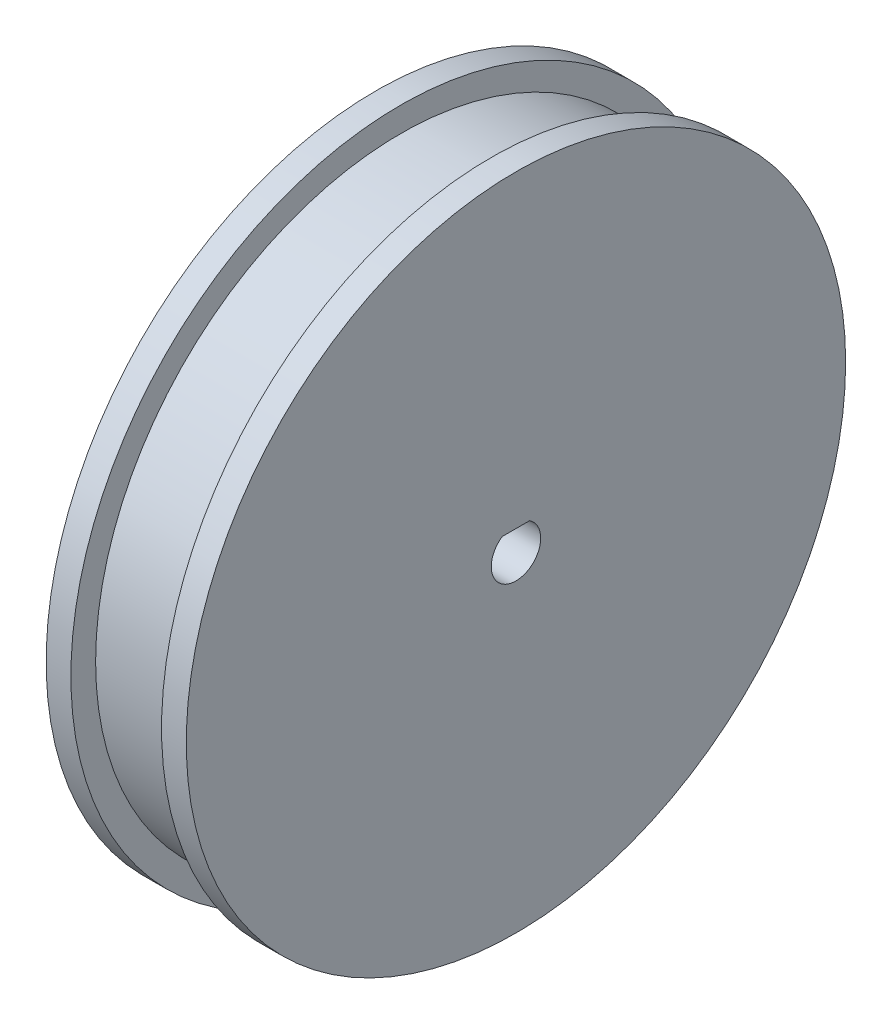
ISO-10303-21;
HEADER;
FILE_DESCRIPTION(('STEP AP214'),'2;1');
FILE_NAME('part.step','',(''),(''),'','','');
FILE_SCHEMA(('AUTOMOTIVE_DESIGN { 1 0 10303 214 1 1 1 1 }'));
ENDSEC;
DATA;
#1=APPLICATION_CONTEXT('core data for automotive mechanical design processes');
#2=APPLICATION_PROTOCOL_DEFINITION('international standard','automotive_design',2000,#1);
#3=PRODUCT_CONTEXT('',#1,'mechanical');
#4=PRODUCT('Part','Part','',(#3));
#5=PRODUCT_RELATED_PRODUCT_CATEGORY('part','',(#4));
#6=PRODUCT_DEFINITION_FORMATION('','',#4);
#7=PRODUCT_DEFINITION_CONTEXT('part definition',#1,'design');
#8=PRODUCT_DEFINITION('design','',#6,#7);
#9=PRODUCT_DEFINITION_SHAPE('','',#8);
#10=(LENGTH_UNIT() NAMED_UNIT(*) SI_UNIT(.MILLI.,.METRE.));
#11=(NAMED_UNIT(*) PLANE_ANGLE_UNIT() SI_UNIT($,.RADIAN.));
#12=(NAMED_UNIT(*) SI_UNIT($,.STERADIAN.) SOLID_ANGLE_UNIT());
#13=UNCERTAINTY_MEASURE_WITH_UNIT(LENGTH_MEASURE(1.E-05),#10,'distance_accuracy_value','');
#14=(GEOMETRIC_REPRESENTATION_CONTEXT(3) GLOBAL_UNCERTAINTY_ASSIGNED_CONTEXT((#13)) GLOBAL_UNIT_ASSIGNED_CONTEXT((#10,
#11,#12)) REPRESENTATION_CONTEXT('',''));
#15=CARTESIAN_POINT('',(0.,0.,0.));
#16=DIRECTION('',(0.,0.,1.));
#17=DIRECTION('',(1.,0.,0.));
#18=AXIS2_PLACEMENT_3D('',#15,#16,#17);
#19=CARTESIAN_POINT('',(-5.,0.,0.));
#20=DIRECTION('',(1.,0.,0.));
#21=DIRECTION('',(0.,0.,-1.));
#22=AXIS2_PLACEMENT_3D('',#19,#20,#21);
#23=CYLINDRICAL_SURFACE('',#22,40.);
#24=CARTESIAN_POINT('',(-5.,0.,0.));
#25=DIRECTION('',(1.,0.,0.));
#26=DIRECTION('',(0.,0.,-1.));
#27=AXIS2_PLACEMENT_3D('',#24,#25,#26);
#28=CIRCLE('',#27,40.);
#29=CARTESIAN_POINT('',(-5.,0.,-40.));
#30=VERTEX_POINT('',#29);
#31=EDGE_CURVE('E11',#30,#30,#28,.T.);
#32=ORIENTED_EDGE('',*,*,#31,.T.);
#33=EDGE_LOOP('',(#32));
#34=FACE_BOUND('',#33,.T.);
#35=CARTESIAN_POINT('',(-2.,0.,0.));
#36=DIRECTION('',(1.,0.,0.));
#37=DIRECTION('',(0.,0.,-1.));
#38=AXIS2_PLACEMENT_3D('',#35,#36,#37);
#39=CIRCLE('',#38,40.);
#40=CARTESIAN_POINT('',(-2.,0.,-40.));
#41=VERTEX_POINT('',#40);
#42=EDGE_CURVE('E93',#41,#41,#39,.T.);
#43=ORIENTED_EDGE('',*,*,#42,.F.);
#44=EDGE_LOOP('',(#43));
#45=FACE_BOUND('',#44,.T.);
#46=ADVANCED_FACE('F33',(#34,#45),#23,.T.);
#47=CARTESIAN_POINT('',(9.,0.,0.));
#48=DIRECTION('',(1.,0.,0.));
#49=DIRECTION('',(0.,0.,-1.));
#50=AXIS2_PLACEMENT_3D('',#47,#48,#49);
#51=CIRCLE('',#50,40.);
#52=CARTESIAN_POINT('',(9.,0.,-40.));
#53=VERTEX_POINT('',#52);
#54=EDGE_CURVE('E72',#53,#53,#51,.T.);
#55=ORIENTED_EDGE('',*,*,#54,.T.);
#56=EDGE_LOOP('',(#55));
#57=FACE_BOUND('',#56,.T.);
#58=CARTESIAN_POINT('',(12.,0.,0.));
#59=DIRECTION('',(1.,0.,0.));
#60=DIRECTION('',(0.,0.,-1.));
#61=AXIS2_PLACEMENT_3D('',#58,#59,#60);
#62=CIRCLE('',#61,40.);
#63=CARTESIAN_POINT('',(12.,0.,-40.));
#64=VERTEX_POINT('',#63);
#65=EDGE_CURVE('E69',#64,#64,#62,.T.);
#66=ORIENTED_EDGE('',*,*,#65,.F.);
#67=EDGE_LOOP('',(#66));
#68=FACE_BOUND('',#67,.T.);
#69=ADVANCED_FACE('F35',(#57,#68),#23,.T.);
#70=CARTESIAN_POINT('',(-5.,0.,0.));
#71=DIRECTION('',(1.,0.,0.));
#72=DIRECTION('',(0.,0.,-1.));
#73=AXIS2_PLACEMENT_3D('',#70,#71,#72);
#74=PLANE('',#73);
#75=DIRECTION('',(0.,0.,1.));
#76=VECTOR('',#75,1.);
#77=CARTESIAN_POINT('',(-5.,2.5,1.6583123951777));
#78=LINE('',#77,#76);
#79=CARTESIAN_POINT('',(-5.,2.5,-1.6583123951777));
#80=VERTEX_POINT('',#79);
#81=CARTESIAN_POINT('',(-5.,2.5,1.6583123951777));
#82=VERTEX_POINT('',#81);
#83=EDGE_CURVE('E82',#80,#82,#78,.T.);
#84=ORIENTED_EDGE('',*,*,#83,.T.);
#85=CARTESIAN_POINT('',(-5.,0.,0.));
#86=DIRECTION('',(1.,0.,0.));
#87=DIRECTION('',(0.,0.,-1.));
#88=AXIS2_PLACEMENT_3D('',#85,#86,#87);
#89=CIRCLE('',#88,3.);
#90=EDGE_CURVE('E48',#82,#80,#89,.T.);
#91=ORIENTED_EDGE('',*,*,#90,.T.);
#92=EDGE_LOOP('',(#84,#91));
#93=FACE_BOUND('',#92,.T.);
#94=ORIENTED_EDGE('',*,*,#31,.F.);
#95=EDGE_LOOP('',(#94));
#96=FACE_BOUND('',#95,.T.);
#97=ADVANCED_FACE('F84',(#93,#96),#74,.F.);
#98=CARTESIAN_POINT('',(-5.,0.,0.));
#99=DIRECTION('',(1.,0.,0.));
#100=DIRECTION('',(0.,0.,-1.));
#101=AXIS2_PLACEMENT_3D('',#98,#99,#100);
#102=CYLINDRICAL_SURFACE('',#101,3.);
#103=DIRECTION('',(1.,0.,0.));
#104=VECTOR('',#103,1.);
#105=CARTESIAN_POINT('',(-5.,2.5,1.6583123951777));
#106=LINE('',#105,#104);
#107=CARTESIAN_POINT('',(12.,2.5,1.6583123951777));
#108=VERTEX_POINT('',#107);
#109=EDGE_CURVE('E41',#82,#108,#106,.T.);
#110=ORIENTED_EDGE('',*,*,#109,.T.);
#111=CARTESIAN_POINT('',(12.,0.,0.));
#112=DIRECTION('',(1.,0.,0.));
#113=DIRECTION('',(0.,0.,-1.));
#114=AXIS2_PLACEMENT_3D('',#111,#112,#113);
#115=CIRCLE('',#114,3.);
#116=CARTESIAN_POINT('',(12.,2.5,-1.6583123951777));
#117=VERTEX_POINT('',#116);
#118=EDGE_CURVE('E61',#108,#117,#115,.T.);
#119=ORIENTED_EDGE('',*,*,#118,.T.);
#120=DIRECTION('',(1.,0.,0.));
#121=VECTOR('',#120,1.);
#122=CARTESIAN_POINT('',(-5.,2.5,-1.6583123951777));
#123=LINE('',#122,#121);
#124=EDGE_CURVE('E53',#80,#117,#123,.T.);
#125=ORIENTED_EDGE('',*,*,#124,.F.);
#126=ORIENTED_EDGE('',*,*,#90,.F.);
#127=EDGE_LOOP('',(#110,#119,#125,#126));
#128=FACE_BOUND('',#127,.T.);
#129=ADVANCED_FACE('F59',(#128),#102,.F.);
#130=CARTESIAN_POINT('',(-5.,2.5,1.6583123951777));
#131=DIRECTION('',(0.,1.,0.));
#132=DIRECTION('',(0.,0.,1.));
#133=AXIS2_PLACEMENT_3D('',#130,#131,#132);
#134=PLANE('',#133);
#135=ORIENTED_EDGE('',*,*,#124,.T.);
#136=DIRECTION('',(0.,0.,1.));
#137=VECTOR('',#136,1.);
#138=CARTESIAN_POINT('',(12.,2.5,1.6583123951777));
#139=LINE('',#138,#137);
#140=EDGE_CURVE('E66',#117,#108,#139,.T.);
#141=ORIENTED_EDGE('',*,*,#140,.T.);
#142=ORIENTED_EDGE('',*,*,#109,.F.);
#143=ORIENTED_EDGE('',*,*,#83,.F.);
#144=EDGE_LOOP('',(#135,#141,#142,#143));
#145=FACE_BOUND('',#144,.T.);
#146=ADVANCED_FACE('F67',(#145),#134,.F.);
#147=CARTESIAN_POINT('',(12.,0.,0.));
#148=DIRECTION('',(1.,0.,0.));
#149=DIRECTION('',(0.,0.,-1.));
#150=AXIS2_PLACEMENT_3D('',#147,#148,#149);
#151=PLANE('',#150);
#152=ORIENTED_EDGE('',*,*,#65,.T.);
#153=EDGE_LOOP('',(#152));
#154=FACE_BOUND('',#153,.T.);
#155=ORIENTED_EDGE('',*,*,#140,.F.);
#156=ORIENTED_EDGE('',*,*,#118,.F.);
#157=EDGE_LOOP('',(#155,#156));
#158=FACE_BOUND('',#157,.T.);
#159=ADVANCED_FACE('F71',(#154,#158),#151,.T.);
#160=CARTESIAN_POINT('',(9.,0.,0.));
#161=DIRECTION('',(1.,0.,0.));
#162=DIRECTION('',(0.,0.,-1.));
#163=AXIS2_PLACEMENT_3D('',#160,#161,#162);
#164=PLANE('',#163);
#165=ORIENTED_EDGE('',*,*,#54,.F.);
#166=EDGE_LOOP('',(#165));
#167=FACE_BOUND('',#166,.T.);
#168=CARTESIAN_POINT('',(9.,0.,0.));
#169=DIRECTION('',(1.,0.,0.));
#170=DIRECTION('',(0.,0.,-1.));
#171=AXIS2_PLACEMENT_3D('',#168,#169,#170);
#172=CIRCLE('',#171,37.);
#173=CARTESIAN_POINT('',(9.,0.,-37.));
#174=VERTEX_POINT('',#173);
#175=EDGE_CURVE('E75',#174,#174,#172,.T.);
#176=ORIENTED_EDGE('',*,*,#175,.T.);
#177=EDGE_LOOP('',(#176));
#178=FACE_BOUND('',#177,.T.);
#179=ADVANCED_FACE('F110',(#167,#178),#164,.F.);
#180=CARTESIAN_POINT('',(9.,0.,0.));
#181=DIRECTION('',(-1.,0.,0.));
#182=DIRECTION('',(0.,0.,1.));
#183=AXIS2_PLACEMENT_3D('',#180,#181,#182);
#184=CYLINDRICAL_SURFACE('',#183,37.);
#185=ORIENTED_EDGE('',*,*,#175,.F.);
#186=EDGE_LOOP('',(#185));
#187=FACE_BOUND('',#186,.T.);
#188=CARTESIAN_POINT('',(-2.,0.,0.));
#189=DIRECTION('',(1.,0.,0.));
#190=DIRECTION('',(0.,0.,-1.));
#191=AXIS2_PLACEMENT_3D('',#188,#189,#190);
#192=CIRCLE('',#191,37.);
#193=CARTESIAN_POINT('',(-2.,0.,-37.));
#194=VERTEX_POINT('',#193);
#195=EDGE_CURVE('E95',#194,#194,#192,.T.);
#196=ORIENTED_EDGE('',*,*,#195,.T.);
#197=EDGE_LOOP('',(#196));
#198=FACE_BOUND('',#197,.T.);
#199=ADVANCED_FACE('F102',(#187,#198),#184,.T.);
#200=CARTESIAN_POINT('',(-2.,0.,0.));
#201=DIRECTION('',(1.,0.,0.));
#202=DIRECTION('',(0.,0.,-1.));
#203=AXIS2_PLACEMENT_3D('',#200,#201,#202);
#204=PLANE('',#203);
#205=ORIENTED_EDGE('',*,*,#195,.F.);
#206=EDGE_LOOP('',(#205));
#207=FACE_BOUND('',#206,.T.);
#208=ORIENTED_EDGE('',*,*,#42,.T.);
#209=EDGE_LOOP('',(#208));
#210=FACE_BOUND('',#209,.T.);
#211=ADVANCED_FACE('F104',(#207,#210),#204,.T.);
#212=CLOSED_SHELL('',(#46,#69,#97,#129,#146,#159,#179,#199,#211));
#213=MANIFOLD_SOLID_BREP('B2',#212);
#214=ADVANCED_BREP_SHAPE_REPRESENTATION('',(#18,#213),#14);
#215=SHAPE_DEFINITION_REPRESENTATION(#9,#214);
ENDSEC;
END-ISO-10303-21;
